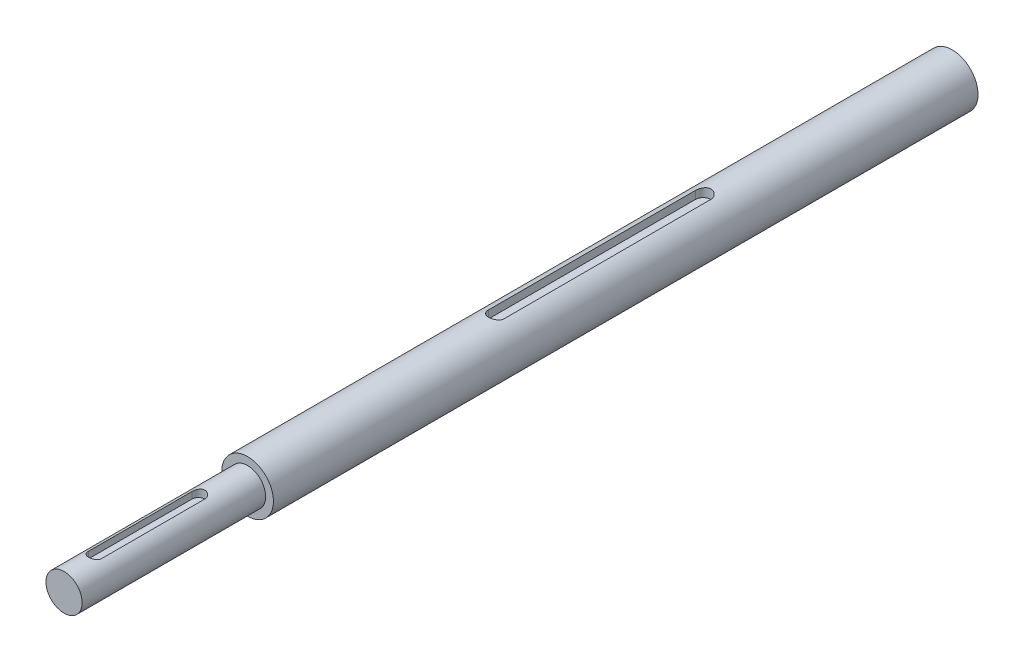
ISO-10303-21;
HEADER;
FILE_DESCRIPTION(('STEP AP214'),'2;1');
FILE_NAME('part.step','',(''),(''),'','','');
FILE_SCHEMA(('AUTOMOTIVE_DESIGN { 1 0 10303 214 1 1 1 1 }'));
ENDSEC;
DATA;
#1=APPLICATION_CONTEXT('core data for automotive mechanical design processes');
#2=APPLICATION_PROTOCOL_DEFINITION('international standard','automotive_design',2000,#1);
#3=PRODUCT_CONTEXT('',#1,'mechanical');
#4=PRODUCT('Part','Part','',(#3));
#5=PRODUCT_RELATED_PRODUCT_CATEGORY('part','',(#4));
#6=PRODUCT_DEFINITION_FORMATION('','',#4);
#7=PRODUCT_DEFINITION_CONTEXT('part definition',#1,'design');
#8=PRODUCT_DEFINITION('design','',#6,#7);
#9=PRODUCT_DEFINITION_SHAPE('','',#8);
#10=(LENGTH_UNIT() NAMED_UNIT(*) SI_UNIT(.MILLI.,.METRE.));
#11=(NAMED_UNIT(*) PLANE_ANGLE_UNIT() SI_UNIT($,.RADIAN.));
#12=(NAMED_UNIT(*) SI_UNIT($,.STERADIAN.) SOLID_ANGLE_UNIT());
#13=UNCERTAINTY_MEASURE_WITH_UNIT(LENGTH_MEASURE(1.E-05),#10,'distance_accuracy_value','');
#14=(GEOMETRIC_REPRESENTATION_CONTEXT(3) GLOBAL_UNCERTAINTY_ASSIGNED_CONTEXT((#13)) GLOBAL_UNIT_ASSIGNED_CONTEXT((#10,
#11,#12)) REPRESENTATION_CONTEXT('',''));
#15=CARTESIAN_POINT('',(0.,0.,0.));
#16=DIRECTION('',(0.,0.,1.));
#17=DIRECTION('',(1.,0.,0.));
#18=AXIS2_PLACEMENT_3D('',#15,#16,#17);
#19=CARTESIAN_POINT('',(0.,0.,136.3));
#20=DIRECTION('',(0.,0.,-1.));
#21=DIRECTION('',(-1.,0.,0.));
#22=AXIS2_PLACEMENT_3D('',#19,#20,#21);
#23=CYLINDRICAL_SURFACE('',#22,10.);
#24=DIRECTION('',(0.,0.,-1.));
#25=VECTOR('',#24,1.);
#26=CARTESIAN_POINT('',(-2.99999999999998,9.53939201416946,136.3));
#27=LINE('',#26,#25);
#28=CARTESIAN_POINT('',(-3.,9.53939201416946,40.));
#29=VERTEX_POINT('',#28);
#30=CARTESIAN_POINT('',(-3.00000000000002,9.53939201416945,-40.));
#31=VERTEX_POINT('',#30);
#32=EDGE_CURVE('E11',#29,#31,#27,.T.);
#33=ORIENTED_EDGE('',*,*,#32,.T.);
#34=CARTESIAN_POINT('',(-3.00000000000002,9.53939201416945,-40.));
#35=CARTESIAN_POINT('',(-3.00001027845729,9.53938054248206,-40.0823355208227));
#36=CARTESIAN_POINT('',(-2.99661062684474,9.54045772064378,-40.1646644550632));
#37=CARTESIAN_POINT('',(-2.98307142899348,9.54470412105985,-40.3286939527655));
#38=CARTESIAN_POINT('',(-2.9729333980542,9.54787287296848,-40.4103946533244));
#39=CARTESIAN_POINT('',(-2.94603140625047,9.55620668351002,-40.5723849156732));
#40=CARTESIAN_POINT('',(-2.92928426957739,9.56136667250114,-40.652677524043));
#41=CARTESIAN_POINT('',(-2.88932853030396,9.57351626651178,-40.8114758441342));
#42=CARTESIAN_POINT('',(-2.86611975872642,9.58050591937827,-40.8899815090674));
#43=CARTESIAN_POINT('',(-2.78708584446026,9.60391637654136,-41.1219493879901));
#44=CARTESIAN_POINT('',(-2.72181852542974,9.6227900783039,-41.272068438833));
#45=CARTESIAN_POINT('',(-2.56815043531277,9.66493213967818,-41.559226043979));
#46=CARTESIAN_POINT('',(-2.47973889924161,9.6882025429064,-41.6962584707622));
#47=CARTESIAN_POINT('',(-2.27929879634444,9.73733650515374,-41.9577229879478));
#48=CARTESIAN_POINT('',(-2.16666914746585,9.76325505469873,-42.0816848740609));
#49=CARTESIAN_POINT('',(-1.92227736150435,9.81429628475076,-42.3092736148388));
#50=CARTESIAN_POINT('',(-1.79051199848165,9.83941883019409,-42.412897033861));
#51=CARTESIAN_POINT('',(-1.50821997465698,9.88666477976534,-42.5989268650946));
#52=CARTESIAN_POINT('',(-1.35736167401017,9.90871541546877,-42.6808501797826));
#53=CARTESIAN_POINT('',(-1.04324233568304,9.94668940088144,-42.8179770040029));
#54=CARTESIAN_POINT('',(-0.879984508687999,9.96261433032402,-42.873187403368));
#55=CARTESIAN_POINT('',(-0.550649404820616,9.98615279768397,-42.953759551791));
#56=CARTESIAN_POINT('',(-0.384786253016218,9.99399098526792,-42.9799297035176));
#57=CARTESIAN_POINT('',(-0.0508471415689425,10.0012640407204,-43.004234695146));
#58=CARTESIAN_POINT('',(0.117228393125325,10.0007004995012,-43.0023748426782));
#59=CARTESIAN_POINT('',(0.445143199271811,9.99139205125586,-42.9712141793086));
#60=CARTESIAN_POINT('',(0.605074290763014,9.98290831016512,-42.9427893091919));
#61=CARTESIAN_POINT('',(0.9177801043703,9.95903027401822,-42.8607367303745));
#62=CARTESIAN_POINT('',(1.07055445110878,9.94363561692558,-42.8071077013173));
#63=CARTESIAN_POINT('',(1.3666956317391,9.90730429851782,-42.6755755564752));
#64=CARTESIAN_POINT('',(1.50993201207611,9.88630511384915,-42.5973967112239));
#65=CARTESIAN_POINT('',(1.78153105916099,9.84099249303647,-42.4192028199656));
#66=CARTESIAN_POINT('',(1.90989038323249,9.81667831471806,-42.3191828810593));
#67=CARTESIAN_POINT('',(2.15330901082204,9.7662334714278,-42.0956160238154));
#68=CARTESIAN_POINT('',(2.26766702955974,9.74006890899097,-41.9713122724738));
#69=CARTESIAN_POINT('',(2.47413538985065,9.68968430229327,-41.7050051531489));
#70=CARTESIAN_POINT('',(2.56623924026179,9.66546482675134,-41.5629966392702));
#71=CARTESIAN_POINT('',(2.726328144817,9.62154457591303,-41.2634381431001));
#72=CARTESIAN_POINT('',(2.79406012682261,9.60189192491896,-41.1057456408129));
#73=CARTESIAN_POINT('',(2.90171772009403,9.56991327306403,-40.7805509920369));
#74=CARTESIAN_POINT('',(2.94168586436071,9.5575760695175,-40.6130642785713));
#75=CARTESIAN_POINT('',(2.97802407180157,9.54628064650012,-40.3700102218596));
#76=CARTESIAN_POINT('',(2.98626405978016,9.54370312550534,-40.2962185316408));
#77=CARTESIAN_POINT('',(2.99724711229707,9.54025857223565,-40.148297041801));
#78=CARTESIAN_POINT('',(2.99999825936536,9.53938902493288,-40.0741679006723));
#79=CARTESIAN_POINT('',(2.99999999999999,9.53939201416946,-40.));
#80=B_SPLINE_CURVE_WITH_KNOTS('',3,(#34,#35,#36,#37,#38,#39,#40,#41,#42,#43,#44,#45,#46,#47,#48,
#49,#50,#51,#52,#53,#54,#55,#56,#57,#58,#59,#60,#61,#62,#63,#64,#65,#66,#67,#68,#69,#70,#71,#72,
#73,#74,#75,#76,#77,#78,#79),.UNSPECIFIED.,.F.,.F.,(4,2,2,2,2,2,2,2,2,2,2,2,2,2,2,2,2,2,2,2,2,2,
4),(0.,0.246918142439474,0.493780777706087,0.740019009623013,0.986263681482027,1.47813347402026,
1.97023245590779,2.47635119822766,2.98255536239032,3.4992281062007,4.01576751791672,
4.51753600864764,5.01920948804101,5.50490358251093,5.99062312360831,6.48200583350621,
6.9734987373917,7.48389234847122,7.99443465298714,8.51013494368214,9.02504345105574,
9.24774267716779,9.47011372732391),.UNSPECIFIED.);
#81=CARTESIAN_POINT('',(2.99999999999999,9.53939201416945,-40.));
#82=VERTEX_POINT('',#81);
#83=EDGE_CURVE('E323',#31,#82,#80,.T.);
#84=ORIENTED_EDGE('',*,*,#83,.T.);
#85=DIRECTION('',(0.,0.,-1.));
#86=VECTOR('',#85,1.);
#87=CARTESIAN_POINT('',(3.00000000000002,9.53939201416945,136.3));
#88=LINE('',#87,#86);
#89=CARTESIAN_POINT('',(3.00000000000002,9.53939201416945,40.));
#90=VERTEX_POINT('',#89);
#91=EDGE_CURVE('E45',#82,#90,#88,.F.);
#92=ORIENTED_EDGE('',*,*,#91,.T.);
#93=CARTESIAN_POINT('',(3.,9.53939201416945,40.));
#94=CARTESIAN_POINT('',(3.00001027845728,9.53938054248206,40.0823355208227));
#95=CARTESIAN_POINT('',(2.99661062684472,9.54045772064378,40.1646644550632));
#96=CARTESIAN_POINT('',(2.98307142899347,9.54470412105986,40.3286939527655));
#97=CARTESIAN_POINT('',(2.97293339805418,9.54787287296848,40.4103946533244));
#98=CARTESIAN_POINT('',(2.94603140625045,9.55620668351003,40.5723849156732));
#99=CARTESIAN_POINT('',(2.92928426957737,9.56136667250114,40.652677524043));
#100=CARTESIAN_POINT('',(2.88932853030395,9.57351626651178,40.8114758441342));
#101=CARTESIAN_POINT('',(2.8661197587264,9.58050591937827,40.8899815090674));
#102=CARTESIAN_POINT('',(2.78708584446024,9.60391637654136,41.1219493879901));
#103=CARTESIAN_POINT('',(2.72181852542972,9.6227900783039,41.272068438833));
#104=CARTESIAN_POINT('',(2.56815043531275,9.66493213967819,41.559226043979));
#105=CARTESIAN_POINT('',(2.47973889924159,9.68820254290641,41.6962584707622));
#106=CARTESIAN_POINT('',(2.27929879634442,9.73733650515374,41.9577229879478));
#107=CARTESIAN_POINT('',(2.16666914746584,9.76325505469874,42.0816848740609));
#108=CARTESIAN_POINT('',(1.92227736150433,9.81429628475077,42.3092736148388));
#109=CARTESIAN_POINT('',(1.79051199848163,9.8394188301941,42.412897033861));
#110=CARTESIAN_POINT('',(1.50821997465696,9.88666477976534,42.5989268650946));
#111=CARTESIAN_POINT('',(1.35736167401015,9.90871541546877,42.6808501797826));
#112=CARTESIAN_POINT('',(1.04324233568302,9.94668940088144,42.8179770040029));
#113=CARTESIAN_POINT('',(0.879984508687982,9.96261433032402,42.873187403368));
#114=CARTESIAN_POINT('',(0.550649404820599,9.98615279768397,42.953759551791));
#115=CARTESIAN_POINT('',(0.384786253016201,9.99399098526792,42.9799297035176));
#116=CARTESIAN_POINT('',(0.0508471415689259,10.0012640407204,43.004234695146));
#117=CARTESIAN_POINT('',(-0.117228393125341,10.0007004995012,43.0023748426782));
#118=CARTESIAN_POINT('',(-0.445143199271826,9.99139205125586,42.9712141793086));
#119=CARTESIAN_POINT('',(-0.605074290763029,9.98290831016512,42.9427893091919));
#120=CARTESIAN_POINT('',(-0.917780104370315,9.95903027401822,42.8607367303745));
#121=CARTESIAN_POINT('',(-1.07055445110879,9.94363561692558,42.8071077013173));
#122=CARTESIAN_POINT('',(-1.36669563173912,9.90730429851782,42.6755755564752));
#123=CARTESIAN_POINT('',(-1.50993201207613,9.88630511384915,42.5973967112239));
#124=CARTESIAN_POINT('',(-1.781531059161,9.84099249303646,42.4192028199656));
#125=CARTESIAN_POINT('',(-1.9098903832325,9.81667831471806,42.3191828810593));
#126=CARTESIAN_POINT('',(-2.15330901082205,9.7662334714278,42.0956160238154));
#127=CARTESIAN_POINT('',(-2.26766702955975,9.74006890899097,41.9713122724738));
#128=CARTESIAN_POINT('',(-2.47413538985067,9.68968430229327,41.7050051531489));
#129=CARTESIAN_POINT('',(-2.5662392402618,9.66546482675133,41.5629966392702));
#130=CARTESIAN_POINT('',(-2.72632814481701,9.62154457591303,41.2634381431001));
#131=CARTESIAN_POINT('',(-2.79406012682263,9.60189192491895,41.1057456408129));
#132=CARTESIAN_POINT('',(-2.90171772009404,9.56991327306402,40.7805509920369));
#133=CARTESIAN_POINT('',(-2.94168586436072,9.55757606951749,40.6130642785713));
#134=CARTESIAN_POINT('',(-2.97802407180159,9.54628064650011,40.3700102218596));
#135=CARTESIAN_POINT('',(-2.98626405978017,9.54370312550533,40.2962185316408));
#136=CARTESIAN_POINT('',(-2.99724711229709,9.54025857223564,40.148297041801));
#137=CARTESIAN_POINT('',(-2.99999825936538,9.53938902493288,40.0741679006723));
#138=CARTESIAN_POINT('',(-3.,9.53939201416945,40.));
#139=B_SPLINE_CURVE_WITH_KNOTS('',3,(#93,#94,#95,#96,#97,#98,#99,#100,#101,#102,#103,#104,#105,
#106,#107,#108,#109,#110,#111,#112,#113,#114,#115,#116,#117,#118,#119,#120,#121,#122,#123,#124,
#125,#126,#127,#128,#129,#130,#131,#132,#133,#134,#135,#136,#137,#138),.UNSPECIFIED.,.F.,.F.,(4,
2,2,2,2,2,2,2,2,2,2,2,2,2,2,2,2,2,2,2,2,2,4),(0.,0.246918142439474,0.493780777706094,
0.740019009623013,0.986263681482027,1.47813347402026,1.97023245590779,2.47635119822767,
2.98255536239034,3.49922810620071,4.01576751791672,4.51753600864764,5.01920948804101,
5.50490358251093,5.99062312360831,6.48200583350621,6.9734987373917,7.48389234847122,
7.99443465298714,8.51013494368214,9.02504345105574,9.24774267716779,9.47011372732391),.UNSPECIFIED.);
#140=EDGE_CURVE('E52',#90,#29,#139,.T.);
#141=ORIENTED_EDGE('',*,*,#140,.T.);
#142=EDGE_LOOP('',(#33,#84,#92,#141));
#143=FACE_BOUND('',#142,.T.);
#144=CARTESIAN_POINT('',(0.,0.,136.3));
#145=DIRECTION('',(0.,0.,1.));
#146=DIRECTION('',(1.,0.,0.));
#147=AXIS2_PLACEMENT_3D('',#144,#145,#146);
#148=CIRCLE('',#147,10.);
#149=CARTESIAN_POINT('',(10.,0.,136.3));
#150=VERTEX_POINT('',#149);
#151=EDGE_CURVE('E164',#150,#150,#148,.T.);
#152=ORIENTED_EDGE('',*,*,#151,.F.);
#153=EDGE_LOOP('',(#152));
#154=FACE_BOUND('',#153,.T.);
#155=CARTESIAN_POINT('',(0.,0.,-136.3));
#156=DIRECTION('',(0.,0.,1.));
#157=DIRECTION('',(1.,0.,0.));
#158=AXIS2_PLACEMENT_3D('',#155,#156,#157);
#159=CIRCLE('',#158,10.);
#160=CARTESIAN_POINT('',(10.,0.,-136.3));
#161=VERTEX_POINT('',#160);
#162=EDGE_CURVE('E159',#161,#161,#159,.T.);
#163=ORIENTED_EDGE('',*,*,#162,.T.);
#164=EDGE_LOOP('',(#163));
#165=FACE_BOUND('',#164,.T.);
#166=ADVANCED_FACE('F37',(#143,#154,#165),#23,.T.);
#167=CARTESIAN_POINT('',(0.,0.,136.3));
#168=DIRECTION('',(0.,0.,1.));
#169=DIRECTION('',(1.,0.,0.));
#170=AXIS2_PLACEMENT_3D('',#167,#168,#169);
#171=PLANE('',#170);
#172=CARTESIAN_POINT('',(0.,0.,136.3));
#173=DIRECTION('',(0.,0.,1.));
#174=DIRECTION('',(1.,0.,0.));
#175=AXIS2_PLACEMENT_3D('',#172,#173,#174);
#176=CIRCLE('',#175,7.);
#177=CARTESIAN_POINT('',(7.,0.,136.3));
#178=VERTEX_POINT('',#177);
#179=EDGE_CURVE('E160',#178,#178,#176,.T.);
#180=ORIENTED_EDGE('',*,*,#179,.F.);
#181=EDGE_LOOP('',(#180));
#182=FACE_BOUND('',#181,.T.);
#183=ORIENTED_EDGE('',*,*,#151,.T.);
#184=EDGE_LOOP('',(#183));
#185=FACE_BOUND('',#184,.T.);
#186=ADVANCED_FACE('F211',(#182,#185),#171,.T.);
#187=CARTESIAN_POINT('',(0.,0.,-136.3));
#188=DIRECTION('',(0.,0.,1.));
#189=DIRECTION('',(1.,0.,0.));
#190=AXIS2_PLACEMENT_3D('',#187,#188,#189);
#191=PLANE('',#190);
#192=ORIENTED_EDGE('',*,*,#162,.F.);
#193=EDGE_LOOP('',(#192));
#194=FACE_BOUND('',#193,.T.);
#195=ADVANCED_FACE('F208',(#194),#191,.F.);
#196=CARTESIAN_POINT('',(0.,0.,207.3));
#197=DIRECTION('',(0.,0.,-1.));
#198=DIRECTION('',(-1.,0.,0.));
#199=AXIS2_PLACEMENT_3D('',#196,#197,#198);
#200=CYLINDRICAL_SURFACE('',#199,7.);
#201=DIRECTION('',(0.,0.,-1.));
#202=VECTOR('',#201,1.);
#203=CARTESIAN_POINT('',(2.50000000000001,6.53834841531101,207.3));
#204=LINE('',#203,#202);
#205=CARTESIAN_POINT('',(2.49999999999999,6.53834841531101,155.3));
#206=VERTEX_POINT('',#205);
#207=CARTESIAN_POINT('',(2.50000000000001,6.53834841531101,195.3));
#208=VERTEX_POINT('',#207);
#209=EDGE_CURVE('E330',#206,#208,#204,.F.);
#210=ORIENTED_EDGE('',*,*,#209,.T.);
#211=CARTESIAN_POINT('',(2.50000000000001,6.53834841531101,195.3));
#212=CARTESIAN_POINT('',(2.50000932220904,6.53833653785132,195.367889245729));
#213=CARTESIAN_POINT('',(2.49723485076695,6.53940549922738,195.435771932639));
#214=CARTESIAN_POINT('',(2.48619102118161,6.54361657478133,195.571003910611));
#215=CARTESIAN_POINT('',(2.4779233455121,6.54675805418062,195.638353358606));
#216=CARTESIAN_POINT('',(2.45600175285901,6.55501217637941,195.771821414603));
#217=CARTESIAN_POINT('',(2.44236559963956,6.56011831705675,195.83794333634));
#218=CARTESIAN_POINT('',(2.4098511546665,6.57213177854175,195.968701835108));
#219=CARTESIAN_POINT('',(2.39097263107437,6.57903917900746,196.033338346312));
#220=CARTESIAN_POINT('',(2.32673964179206,6.60214934365709,196.224264366477));
#221=CARTESIAN_POINT('',(2.27375112606987,6.62075475340844,196.347790452136));
#222=CARTESIAN_POINT('',(2.14910757865426,6.6622539736071,196.584230333128));
#223=CARTESIAN_POINT('',(2.0774389504885,6.68515090424875,196.697136316736));
#224=CARTESIAN_POINT('',(1.91402571101971,6.73379913792223,196.914215213353));
#225=CARTESIAN_POINT('',(1.82158337146745,6.75962864041371,197.017846475196));
#226=CARTESIAN_POINT('',(1.62073388776332,6.8105759232303,197.208508704716));
#227=CARTESIAN_POINT('',(1.51232377552675,6.83569357019867,197.295536579243));
#228=CARTESIAN_POINT('',(1.27853915335936,6.88331133279046,197.453089855455));
#229=CARTESIAN_POINT('',(1.15274833789187,6.90570835223796,197.523031521861));
#230=CARTESIAN_POINT('',(0.89025082547666,6.94442357672633,197.640536646797));
#231=CARTESIAN_POINT('',(0.753547890540351,6.96074386585465,197.688107779046));
#232=CARTESIAN_POINT('',(0.478829979256198,6.9849105051071,197.757640602182));
#233=CARTESIAN_POINT('',(0.341079835227489,6.99306594352514,197.780539130471));
#234=CARTESIAN_POINT('',(0.063464305296925,7.00108798053822,197.803068402778));
#235=CARTESIAN_POINT('',(-0.0764004845074283,7.00095687302702,197.802705586035));
#236=CARTESIAN_POINT('',(-0.347593258486926,6.99262258049077,197.779288726239));
#237=CARTESIAN_POINT('',(-0.479022407078699,6.98478243583517,197.757255205801));
#238=CARTESIAN_POINT('',(-0.736175812143587,6.96237832507347,197.692826575841));
#239=CARTESIAN_POINT('',(-0.861899745780445,6.94781397899037,197.650430315637));
#240=CARTESIAN_POINT('',(-1.10616102429805,6.91316506890369,197.545953088435));
#241=CARTESIAN_POINT('',(-1.22457279066904,6.89300592164314,197.48360428504));
#242=CARTESIAN_POINT('',(-1.44953531305521,6.84923355616321,197.341220664777));
#243=CARTESIAN_POINT('',(-1.55608245176768,6.82561928959264,197.261180476216));
#244=CARTESIAN_POINT('',(-1.76032445256067,6.7759054780549,197.080676736343));
#245=CARTESIAN_POINT('',(-1.85724185700414,6.74974055843876,196.979350276855));
#246=CARTESIAN_POINT('',(-2.03299914621293,6.69890342468976,196.761672635834));
#247=CARTESIAN_POINT('',(-2.1118325545646,6.67423174765258,196.645316094832));
#248=CARTESIAN_POINT('',(-2.25049860898457,6.62877803875406,196.398057401478));
#249=CARTESIAN_POINT('',(-2.30994207989623,6.60807875118995,196.266921024495));
#250=CARTESIAN_POINT('',(-2.40555439725848,6.57388213610268,195.995635198418));
#251=CARTESIAN_POINT('',(-2.44176119399952,6.56037307165054,195.855500858831));
#252=CARTESIAN_POINT('',(-2.47705497148626,6.54708542245562,195.644969455736));
#253=CARTESIAN_POINT('',(-2.48565347586444,6.54382010967907,195.576263698228));
#254=CARTESIAN_POINT('',(-2.49712352174882,6.53944910829676,195.438384835808));
#255=CARTESIAN_POINT('',(-2.50000139665367,6.53834103140935,195.369212332899));
#256=CARTESIAN_POINT('',(-2.49999999999999,6.53834841531101,195.3));
#257=B_SPLINE_CURVE_WITH_KNOTS('',3,(#211,#212,#213,#214,#215,#216,#217,#218,#219,#220,#221,
#222,#223,#224,#225,#226,#227,#228,#229,#230,#231,#232,#233,#234,#235,#236,#237,#238,#239,#240,
#241,#242,#243,#244,#245,#246,#247,#248,#249,#250,#251,#252,#253,#254,#255,#256),.UNSPECIFIED.,
.F.,.F.,(4,2,2,2,2,2,2,2,2,2,2,2,2,2,2,2,2,2,2,2,2,2,4),(0.,0.20359162855153,0.407120929225478,
0.609982356545699,0.812852756635974,1.21793118555512,1.62330528148469,2.04515972311928,
2.46709267811838,2.90188398965559,3.33652604665236,3.7540099394086,4.17137826416921,
4.56998920861346,4.96862268086886,5.37284909448638,5.77719841367919,6.20315837945082,
6.62927065674716,7.06347329058501,7.49696496492443,7.70468580162773,7.91217653896406),.UNSPECIFIED.);
#258=CARTESIAN_POINT('',(-2.49999999999999,6.53834841531101,195.3));
#259=VERTEX_POINT('',#258);
#260=EDGE_CURVE('E163',#208,#259,#257,.T.);
#261=ORIENTED_EDGE('',*,*,#260,.T.);
#262=DIRECTION('',(0.,0.,-1.));
#263=VECTOR('',#262,1.);
#264=CARTESIAN_POINT('',(-2.49999999999999,6.53834841531101,207.3));
#265=LINE('',#264,#263);
#266=CARTESIAN_POINT('',(-2.49999999999999,6.53834841531101,155.3));
#267=VERTEX_POINT('',#266);
#268=EDGE_CURVE('E337',#259,#267,#265,.T.);
#269=ORIENTED_EDGE('',*,*,#268,.T.);
#270=CARTESIAN_POINT('',(-2.49999999999998,6.53834841531102,155.3));
#271=CARTESIAN_POINT('',(-2.50000932220901,6.53833653785134,155.232110754271));
#272=CARTESIAN_POINT('',(-2.49723485076691,6.53940549922739,155.164228067361));
#273=CARTESIAN_POINT('',(-2.48619102118157,6.54361657478134,155.028996089389));
#274=CARTESIAN_POINT('',(-2.47792334551206,6.54675805418063,154.961646641394));
#275=CARTESIAN_POINT('',(-2.45600175285898,6.55501217637943,154.828178585397));
#276=CARTESIAN_POINT('',(-2.44236559963953,6.56011831705677,154.76205666366));
#277=CARTESIAN_POINT('',(-2.40985115466646,6.57213177854176,154.631298164892));
#278=CARTESIAN_POINT('',(-2.39097263107434,6.57903917900747,154.566661653688));
#279=CARTESIAN_POINT('',(-2.32673964179203,6.6021493436571,154.375735633523));
#280=CARTESIAN_POINT('',(-2.27375112606984,6.62075475340845,154.252209547864));
#281=CARTESIAN_POINT('',(-2.14910757865423,6.66225397360711,154.015769666872));
#282=CARTESIAN_POINT('',(-2.07743895048846,6.68515090424876,153.902863683264));
#283=CARTESIAN_POINT('',(-1.91402571101967,6.73379913792225,153.685784786647));
#284=CARTESIAN_POINT('',(-1.82158337146741,6.75962864041372,153.582153524804));
#285=CARTESIAN_POINT('',(-1.62073388776327,6.81057592323031,153.391491295284));
#286=CARTESIAN_POINT('',(-1.51232377552671,6.83569357019868,153.304463420757));
#287=CARTESIAN_POINT('',(-1.27853915335932,6.88331133279047,153.146910144545));
#288=CARTESIAN_POINT('',(-1.15274833789183,6.90570835223797,153.076968478139));
#289=CARTESIAN_POINT('',(-0.890250825476618,6.94442357672633,152.959463353203));
#290=CARTESIAN_POINT('',(-0.753547890540316,6.96074386585465,152.911892220954));
#291=CARTESIAN_POINT('',(-0.478829979256171,6.9849105051071,152.842359397818));
#292=CARTESIAN_POINT('',(-0.341079835227465,6.99306594352515,152.819460869529));
#293=CARTESIAN_POINT('',(-0.0634643052969063,7.00108798053822,152.796931597222));
#294=CARTESIAN_POINT('',(0.0764004845074432,7.00095687302702,152.797294413965));
#295=CARTESIAN_POINT('',(0.347593258486938,6.99262258049077,152.820711273761));
#296=CARTESIAN_POINT('',(0.479022407078713,6.98478243583517,152.842744794199));
#297=CARTESIAN_POINT('',(0.736175812143601,6.96237832507347,152.907173424159));
#298=CARTESIAN_POINT('',(0.861899745780458,6.94781397899037,152.949569684363));
#299=CARTESIAN_POINT('',(1.10616102429806,6.91316506890369,153.054046911565));
#300=CARTESIAN_POINT('',(1.22457279066905,6.89300592164314,153.11639571496));
#301=CARTESIAN_POINT('',(1.44953531305522,6.84923355616321,153.258779335223));
#302=CARTESIAN_POINT('',(1.5560824517677,6.82561928959263,153.338819523784));
#303=CARTESIAN_POINT('',(1.7603244525607,6.7759054780549,153.519323263657));
#304=CARTESIAN_POINT('',(1.85724185700417,6.74974055843875,153.620649723145));
#305=CARTESIAN_POINT('',(2.03299914621296,6.69890342468975,153.838327364166));
#306=CARTESIAN_POINT('',(2.11183255456462,6.67423174765257,153.954683905168));
#307=CARTESIAN_POINT('',(2.25049860898458,6.62877803875405,154.201942598522));
#308=CARTESIAN_POINT('',(2.30994207989624,6.60807875118995,154.333078975505));
#309=CARTESIAN_POINT('',(2.40555439725848,6.57388213610268,154.604364801582));
#310=CARTESIAN_POINT('',(2.44176119399953,6.56037307165054,154.744499141169));
#311=CARTESIAN_POINT('',(2.47705497148627,6.54708542245562,154.955030544264));
#312=CARTESIAN_POINT('',(2.48565347586445,6.54382010967907,155.023736301772));
#313=CARTESIAN_POINT('',(2.49712352174882,6.53944910829676,155.161615164192));
#314=CARTESIAN_POINT('',(2.50000139665368,6.53834103140935,155.230787667101));
#315=CARTESIAN_POINT('',(2.5,6.53834841531101,155.3));
#316=B_SPLINE_CURVE_WITH_KNOTS('',3,(#270,#271,#272,#273,#274,#275,#276,#277,#278,#279,#280,
#281,#282,#283,#284,#285,#286,#287,#288,#289,#290,#291,#292,#293,#294,#295,#296,#297,#298,#299,
#300,#301,#302,#303,#304,#305,#306,#307,#308,#309,#310,#311,#312,#313,#314,#315),.UNSPECIFIED.,
.F.,.F.,(4,2,2,2,2,2,2,2,2,2,2,2,2,2,2,2,2,2,2,2,2,2,4),(0.,0.203591628551585,0.407120929225507,
0.609982356545699,0.812852756635974,1.21793118555512,1.62330528148469,2.04515972311931,
2.46709267811839,2.90188398965561,3.33652604665236,3.75400993940858,4.17137826416919,
4.56998920861343,4.96862268086884,5.37284909448635,5.77719841367917,6.20315837945085,
6.62927065674716,7.06347329058495,7.49696496492439,7.70468580162769,7.91217653896403),.UNSPECIFIED.);
#317=EDGE_CURVE('E60',#267,#206,#316,.T.);
#318=ORIENTED_EDGE('',*,*,#317,.T.);
#319=EDGE_LOOP('',(#210,#261,#269,#318));
#320=FACE_BOUND('',#319,.T.);
#321=CARTESIAN_POINT('',(0.,0.,207.3));
#322=DIRECTION('',(0.,0.,1.));
#323=DIRECTION('',(1.,0.,0.));
#324=AXIS2_PLACEMENT_3D('',#321,#322,#323);
#325=CIRCLE('',#324,7.);
#326=CARTESIAN_POINT('',(7.,0.,207.3));
#327=VERTEX_POINT('',#326);
#328=EDGE_CURVE('E149',#327,#327,#325,.T.);
#329=ORIENTED_EDGE('',*,*,#328,.F.);
#330=EDGE_LOOP('',(#329));
#331=FACE_BOUND('',#330,.T.);
#332=ORIENTED_EDGE('',*,*,#179,.T.);
#333=EDGE_LOOP('',(#332));
#334=FACE_BOUND('',#333,.T.);
#335=ADVANCED_FACE('F183',(#320,#331,#334),#200,.T.);
#336=CARTESIAN_POINT('',(0.,0.,207.3));
#337=DIRECTION('',(0.,0.,1.));
#338=DIRECTION('',(1.,0.,0.));
#339=AXIS2_PLACEMENT_3D('',#336,#337,#338);
#340=PLANE('',#339);
#341=ORIENTED_EDGE('',*,*,#328,.T.);
#342=EDGE_LOOP('',(#341));
#343=FACE_BOUND('',#342,.T.);
#344=ADVANCED_FACE('F202',(#343),#340,.T.);
#345=CARTESIAN_POINT('',(0.,4.,155.3));
#346=DIRECTION('',(0.,1.,0.));
#347=DIRECTION('',(0.,0.,1.));
#348=AXIS2_PLACEMENT_3D('',#345,#346,#347);
#349=CYLINDRICAL_SURFACE('',#348,2.49999999999999);
#350=DIRECTION('',(0.,1.,0.));
#351=VECTOR('',#350,1.);
#352=CARTESIAN_POINT('',(-2.49999999999999,4.,155.3));
#353=LINE('',#352,#351);
#354=CARTESIAN_POINT('',(-2.49999999999999,4.,155.3));
#355=VERTEX_POINT('',#354);
#356=EDGE_CURVE('E146',#355,#267,#353,.T.);
#357=ORIENTED_EDGE('',*,*,#356,.F.);
#358=CARTESIAN_POINT('',(0.,4.,155.3));
#359=DIRECTION('',(0.,1.,0.));
#360=DIRECTION('',(0.,0.,1.));
#361=AXIS2_PLACEMENT_3D('',#358,#359,#360);
#362=CIRCLE('',#361,2.49999999999999);
#363=CARTESIAN_POINT('',(2.49999999999999,4.,155.3));
#364=VERTEX_POINT('',#363);
#365=EDGE_CURVE('E130',#364,#355,#362,.T.);
#366=ORIENTED_EDGE('',*,*,#365,.F.);
#367=DIRECTION('',(0.,1.,0.));
#368=VECTOR('',#367,1.);
#369=CARTESIAN_POINT('',(2.49999999999999,4.,155.3));
#370=LINE('',#369,#368);
#371=EDGE_CURVE('E147',#364,#206,#370,.T.);
#372=ORIENTED_EDGE('',*,*,#371,.T.);
#373=ORIENTED_EDGE('',*,*,#317,.F.);
#374=EDGE_LOOP('',(#357,#366,#372,#373));
#375=FACE_BOUND('',#374,.T.);
#376=ADVANCED_FACE('F199',(#375),#349,.F.);
#377=CARTESIAN_POINT('',(2.49999999999999,4.,155.3));
#378=DIRECTION('',(1.,0.,0.));
#379=DIRECTION('',(0.,0.,-1.));
#380=AXIS2_PLACEMENT_3D('',#377,#378,#379);
#381=PLANE('',#380);
#382=ORIENTED_EDGE('',*,*,#371,.F.);
#383=DIRECTION('',(0.,0.,-1.));
#384=VECTOR('',#383,1.);
#385=CARTESIAN_POINT('',(2.49999999999999,4.,155.3));
#386=LINE('',#385,#384);
#387=CARTESIAN_POINT('',(2.50000000000001,4.,195.3));
#388=VERTEX_POINT('',#387);
#389=EDGE_CURVE('E143',#388,#364,#386,.T.);
#390=ORIENTED_EDGE('',*,*,#389,.F.);
#391=DIRECTION('',(0.,1.,0.));
#392=VECTOR('',#391,1.);
#393=CARTESIAN_POINT('',(2.50000000000001,4.,195.3));
#394=LINE('',#393,#392);
#395=EDGE_CURVE('E150',#388,#208,#394,.T.);
#396=ORIENTED_EDGE('',*,*,#395,.T.);
#397=ORIENTED_EDGE('',*,*,#209,.F.);
#398=EDGE_LOOP('',(#382,#390,#396,#397));
#399=FACE_BOUND('',#398,.T.);
#400=ADVANCED_FACE('F193',(#399),#381,.F.);
#401=CARTESIAN_POINT('',(0.,4.,195.3));
#402=DIRECTION('',(0.,1.,0.));
#403=DIRECTION('',(0.,0.,1.));
#404=AXIS2_PLACEMENT_3D('',#401,#402,#403);
#405=CYLINDRICAL_SURFACE('',#404,2.5);
#406=ORIENTED_EDGE('',*,*,#395,.F.);
#407=CARTESIAN_POINT('',(0.,4.,195.3));
#408=DIRECTION('',(0.,1.,0.));
#409=DIRECTION('',(0.,0.,1.));
#410=AXIS2_PLACEMENT_3D('',#407,#408,#409);
#411=CIRCLE('',#410,2.5);
#412=CARTESIAN_POINT('',(-2.49999999999999,4.,195.3));
#413=VERTEX_POINT('',#412);
#414=EDGE_CURVE('E140',#413,#388,#411,.T.);
#415=ORIENTED_EDGE('',*,*,#414,.F.);
#416=DIRECTION('',(0.,1.,0.));
#417=VECTOR('',#416,1.);
#418=CARTESIAN_POINT('',(-2.49999999999999,4.,195.3));
#419=LINE('',#418,#417);
#420=EDGE_CURVE('E153',#413,#259,#419,.T.);
#421=ORIENTED_EDGE('',*,*,#420,.T.);
#422=ORIENTED_EDGE('',*,*,#260,.F.);
#423=EDGE_LOOP('',(#406,#415,#421,#422));
#424=FACE_BOUND('',#423,.T.);
#425=ADVANCED_FACE('F187',(#424),#405,.F.);
#426=CARTESIAN_POINT('',(-2.49999999999999,4.,155.3));
#427=DIRECTION('',(-1.,0.,0.));
#428=DIRECTION('',(0.,0.,1.));
#429=AXIS2_PLACEMENT_3D('',#426,#427,#428);
#430=PLANE('',#429);
#431=ORIENTED_EDGE('',*,*,#420,.F.);
#432=DIRECTION('',(0.,0.,1.));
#433=VECTOR('',#432,1.);
#434=CARTESIAN_POINT('',(-2.49999999999999,4.,155.3));
#435=LINE('',#434,#433);
#436=EDGE_CURVE('E137',#355,#413,#435,.T.);
#437=ORIENTED_EDGE('',*,*,#436,.F.);
#438=ORIENTED_EDGE('',*,*,#356,.T.);
#439=ORIENTED_EDGE('',*,*,#268,.F.);
#440=EDGE_LOOP('',(#431,#437,#438,#439));
#441=FACE_BOUND('',#440,.T.);
#442=ADVANCED_FACE('F192',(#441),#430,.F.);
#443=CARTESIAN_POINT('',(0.,4.,155.3));
#444=DIRECTION('',(0.,1.,0.));
#445=DIRECTION('',(0.,0.,1.));
#446=AXIS2_PLACEMENT_3D('',#443,#444,#445);
#447=PLANE('',#446);
#448=ORIENTED_EDGE('',*,*,#365,.T.);
#449=ORIENTED_EDGE('',*,*,#436,.T.);
#450=ORIENTED_EDGE('',*,*,#414,.T.);
#451=ORIENTED_EDGE('',*,*,#389,.T.);
#452=EDGE_LOOP('',(#448,#449,#450,#451));
#453=FACE_BOUND('',#452,.T.);
#454=ADVANCED_FACE('F197',(#453),#447,.T.);
#455=CARTESIAN_POINT('',(0.,6.5,40.));
#456=DIRECTION('',(0.,1.,0.));
#457=DIRECTION('',(0.,0.,1.));
#458=AXIS2_PLACEMENT_3D('',#455,#456,#457);
#459=CYLINDRICAL_SURFACE('',#458,3.);
#460=DIRECTION('',(0.,1.,0.));
#461=VECTOR('',#460,1.);
#462=CARTESIAN_POINT('',(3.,6.5,40.));
#463=LINE('',#462,#461);
#464=CARTESIAN_POINT('',(3.,6.5,40.));
#465=VERTEX_POINT('',#464);
#466=EDGE_CURVE('E102',#465,#90,#463,.T.);
#467=ORIENTED_EDGE('',*,*,#466,.F.);
#468=CARTESIAN_POINT('',(0.,6.5,40.));
#469=DIRECTION('',(0.,1.,0.));
#470=DIRECTION('',(0.,0.,1.));
#471=AXIS2_PLACEMENT_3D('',#468,#469,#470);
#472=CIRCLE('',#471,3.);
#473=CARTESIAN_POINT('',(-3.,6.5,40.));
#474=VERTEX_POINT('',#473);
#475=EDGE_CURVE('E106',#474,#465,#472,.T.);
#476=ORIENTED_EDGE('',*,*,#475,.F.);
#477=DIRECTION('',(0.,1.,0.));
#478=VECTOR('',#477,1.);
#479=CARTESIAN_POINT('',(-3.,6.5,40.));
#480=LINE('',#479,#478);
#481=EDGE_CURVE('E128',#474,#29,#480,.T.);
#482=ORIENTED_EDGE('',*,*,#481,.T.);
#483=ORIENTED_EDGE('',*,*,#140,.F.);
#484=EDGE_LOOP('',(#467,#476,#482,#483));
#485=FACE_BOUND('',#484,.T.);
#486=ADVANCED_FACE('F104',(#485),#459,.F.);
#487=CARTESIAN_POINT('',(-3.,6.5,40.));
#488=DIRECTION('',(-1.,0.,0.));
#489=DIRECTION('',(0.,0.,1.));
#490=AXIS2_PLACEMENT_3D('',#487,#488,#489);
#491=PLANE('',#490);
#492=ORIENTED_EDGE('',*,*,#481,.F.);
#493=DIRECTION('',(0.,0.,1.));
#494=VECTOR('',#493,1.);
#495=CARTESIAN_POINT('',(-3.,6.5,40.));
#496=LINE('',#495,#494);
#497=CARTESIAN_POINT('',(-3.00000000000002,6.5,-40.));
#498=VERTEX_POINT('',#497);
#499=EDGE_CURVE('E111',#498,#474,#496,.T.);
#500=ORIENTED_EDGE('',*,*,#499,.F.);
#501=DIRECTION('',(0.,1.,0.));
#502=VECTOR('',#501,1.);
#503=CARTESIAN_POINT('',(-3.00000000000002,6.5,-40.));
#504=LINE('',#503,#502);
#505=EDGE_CURVE('E131',#498,#31,#504,.T.);
#506=ORIENTED_EDGE('',*,*,#505,.T.);
#507=ORIENTED_EDGE('',*,*,#32,.F.);
#508=EDGE_LOOP('',(#492,#500,#506,#507));
#509=FACE_BOUND('',#508,.T.);
#510=ADVANCED_FACE('F282',(#509),#491,.F.);
#511=CARTESIAN_POINT('',(0.,6.5,-40.));
#512=DIRECTION('',(0.,1.,0.));
#513=DIRECTION('',(0.,0.,1.));
#514=AXIS2_PLACEMENT_3D('',#511,#512,#513);
#515=CYLINDRICAL_SURFACE('',#514,3.);
#516=ORIENTED_EDGE('',*,*,#505,.F.);
#517=CARTESIAN_POINT('',(0.,6.5,-40.));
#518=DIRECTION('',(0.,1.,0.));
#519=DIRECTION('',(0.,0.,1.));
#520=AXIS2_PLACEMENT_3D('',#517,#518,#519);
#521=CIRCLE('',#520,3.);
#522=CARTESIAN_POINT('',(2.99999999999999,6.5,-40.));
#523=VERTEX_POINT('',#522);
#524=EDGE_CURVE('E120',#523,#498,#521,.T.);
#525=ORIENTED_EDGE('',*,*,#524,.F.);
#526=DIRECTION('',(0.,1.,0.));
#527=VECTOR('',#526,1.);
#528=CARTESIAN_POINT('',(2.99999999999999,6.5,-40.));
#529=LINE('',#528,#527);
#530=EDGE_CURVE('E110',#523,#82,#529,.T.);
#531=ORIENTED_EDGE('',*,*,#530,.T.);
#532=ORIENTED_EDGE('',*,*,#83,.F.);
#533=EDGE_LOOP('',(#516,#525,#531,#532));
#534=FACE_BOUND('',#533,.T.);
#535=ADVANCED_FACE('F291',(#534),#515,.F.);
#536=CARTESIAN_POINT('',(3.,6.5,40.));
#537=DIRECTION('',(1.,0.,0.));
#538=DIRECTION('',(0.,0.,-1.));
#539=AXIS2_PLACEMENT_3D('',#536,#537,#538);
#540=PLANE('',#539);
#541=ORIENTED_EDGE('',*,*,#530,.F.);
#542=DIRECTION('',(0.,0.,-1.));
#543=VECTOR('',#542,1.);
#544=CARTESIAN_POINT('',(3.,6.5,40.));
#545=LINE('',#544,#543);
#546=EDGE_CURVE('E114',#465,#523,#545,.T.);
#547=ORIENTED_EDGE('',*,*,#546,.F.);
#548=ORIENTED_EDGE('',*,*,#466,.T.);
#549=ORIENTED_EDGE('',*,*,#91,.F.);
#550=EDGE_LOOP('',(#541,#547,#548,#549));
#551=FACE_BOUND('',#550,.T.);
#552=ADVANCED_FACE('F115',(#551),#540,.F.);
#553=CARTESIAN_POINT('',(0.,6.5,40.));
#554=DIRECTION('',(0.,1.,0.));
#555=DIRECTION('',(0.,0.,1.));
#556=AXIS2_PLACEMENT_3D('',#553,#554,#555);
#557=PLANE('',#556);
#558=ORIENTED_EDGE('',*,*,#475,.T.);
#559=ORIENTED_EDGE('',*,*,#546,.T.);
#560=ORIENTED_EDGE('',*,*,#524,.T.);
#561=ORIENTED_EDGE('',*,*,#499,.T.);
#562=EDGE_LOOP('',(#558,#559,#560,#561));
#563=FACE_BOUND('',#562,.T.);
#564=ADVANCED_FACE('F122',(#563),#557,.T.);
#565=CLOSED_SHELL('',(#166,#186,#195,#335,#344,#376,#400,#425,#442,#454,#486,#510,#535,#552,#564));
#566=MANIFOLD_SOLID_BREP('B2',#565);
#567=ADVANCED_BREP_SHAPE_REPRESENTATION('',(#18,#566),#14);
#568=SHAPE_DEFINITION_REPRESENTATION(#9,#567);
ENDSEC;
END-ISO-10303-21;
